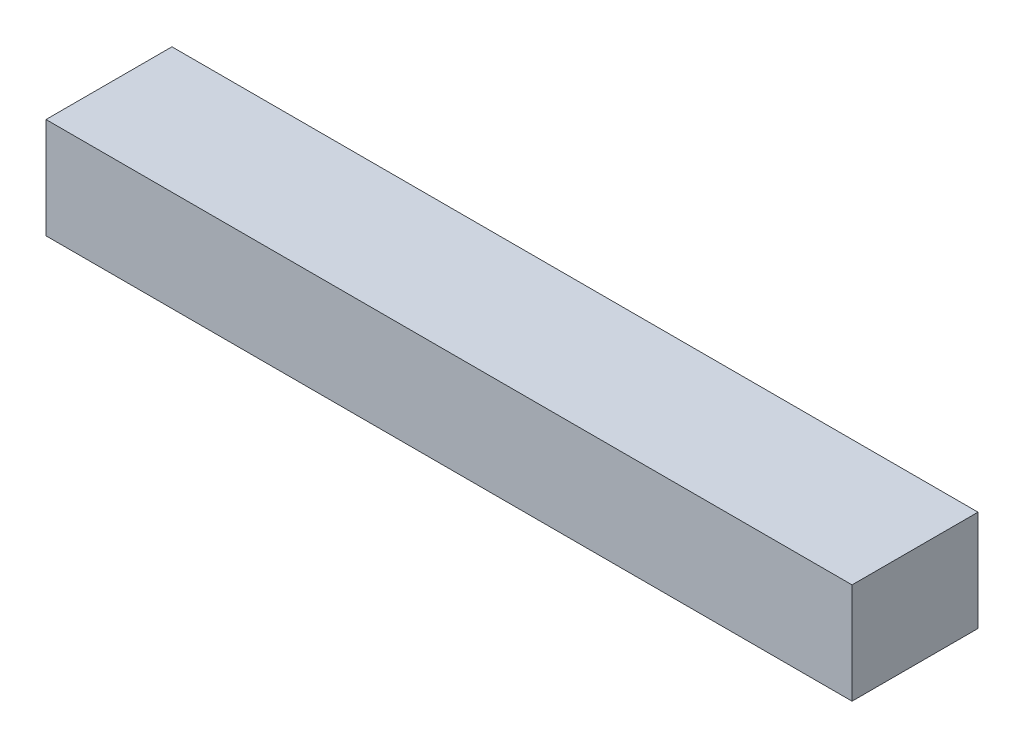
ISO-10303-21;
HEADER;
FILE_DESCRIPTION(('STEP AP214'),'2;1');
FILE_NAME('part.step','',(''),(''),'','','');
FILE_SCHEMA(('AUTOMOTIVE_DESIGN { 1 0 10303 214 1 1 1 1 }'));
ENDSEC;
DATA;
#1=APPLICATION_CONTEXT('core data for automotive mechanical design processes');
#2=APPLICATION_PROTOCOL_DEFINITION('international standard','automotive_design',2000,#1);
#3=PRODUCT_CONTEXT('',#1,'mechanical');
#4=PRODUCT('Part','Part','',(#3));
#5=PRODUCT_RELATED_PRODUCT_CATEGORY('part','',(#4));
#6=PRODUCT_DEFINITION_FORMATION('','',#4);
#7=PRODUCT_DEFINITION_CONTEXT('part definition',#1,'design');
#8=PRODUCT_DEFINITION('design','',#6,#7);
#9=PRODUCT_DEFINITION_SHAPE('','',#8);
#10=(LENGTH_UNIT() NAMED_UNIT(*) SI_UNIT(.MILLI.,.METRE.));
#11=(NAMED_UNIT(*) PLANE_ANGLE_UNIT() SI_UNIT($,.RADIAN.));
#12=(NAMED_UNIT(*) SI_UNIT($,.STERADIAN.) SOLID_ANGLE_UNIT());
#13=UNCERTAINTY_MEASURE_WITH_UNIT(LENGTH_MEASURE(1.E-05),#10,'distance_accuracy_value','');
#14=(GEOMETRIC_REPRESENTATION_CONTEXT(3) GLOBAL_UNCERTAINTY_ASSIGNED_CONTEXT((#13)) GLOBAL_UNIT_ASSIGNED_CONTEXT((#10,
#11,#12)) REPRESENTATION_CONTEXT('',''));
#15=CARTESIAN_POINT('',(0.,0.,0.));
#16=DIRECTION('',(0.,0.,1.));
#17=DIRECTION('',(1.,0.,0.));
#18=AXIS2_PLACEMENT_3D('',#15,#16,#17);
#19=CARTESIAN_POINT('',(4.3681,7.1331,0.8));
#20=DIRECTION('',(0.,1.,0.));
#21=DIRECTION('',(-1.,0.,0.));
#22=AXIS2_PLACEMENT_3D('',#19,#20,#21);
#23=PLANE('',#22);
#24=DIRECTION('',(1.,0.,0.));
#25=VECTOR('',#24,1.);
#26=CARTESIAN_POINT('',(0.,7.1331,2.05));
#27=LINE('',#26,#25);
#28=CARTESIAN_POINT('',(4.3681,7.1331,2.05));
#29=VERTEX_POINT('',#28);
#30=CARTESIAN_POINT('',(-3.6319,7.1331,2.05));
#31=VERTEX_POINT('',#30);
#32=EDGE_CURVE('E69',#29,#31,#27,.F.);
#33=ORIENTED_EDGE('',*,*,#32,.F.);
#34=DIRECTION('',(0.,0.,1.));
#35=VECTOR('',#34,1.);
#36=CARTESIAN_POINT('',(4.3681,7.1331,0.8));
#37=LINE('',#36,#35);
#38=CARTESIAN_POINT('',(4.3681,7.1331,0.8));
#39=VERTEX_POINT('',#38);
#40=EDGE_CURVE('E56',#39,#29,#37,.T.);
#41=ORIENTED_EDGE('',*,*,#40,.F.);
#42=DIRECTION('',(1.,0.,0.));
#43=VECTOR('',#42,1.);
#44=CARTESIAN_POINT('',(0.,7.1331,0.8));
#45=LINE('',#44,#43);
#46=CARTESIAN_POINT('',(-3.6319,7.1331,0.8));
#47=VERTEX_POINT('',#46);
#48=EDGE_CURVE('E62',#39,#47,#45,.F.);
#49=ORIENTED_EDGE('',*,*,#48,.T.);
#50=DIRECTION('',(0.,0.,1.));
#51=VECTOR('',#50,1.);
#52=CARTESIAN_POINT('',(-3.6319,7.1331,0.8));
#53=LINE('',#52,#51);
#54=EDGE_CURVE('E20',#47,#31,#53,.T.);
#55=ORIENTED_EDGE('',*,*,#54,.T.);
#56=EDGE_LOOP('',(#33,#41,#49,#55));
#57=FACE_BOUND('',#56,.T.);
#58=ADVANCED_FACE('F17',(#57),#23,.T.);
#59=CARTESIAN_POINT('',(0.,0.,0.8));
#60=DIRECTION('',(0.,0.,1.));
#61=DIRECTION('',(1.,0.,0.));
#62=AXIS2_PLACEMENT_3D('',#59,#60,#61);
#63=PLANE('',#62);
#64=ORIENTED_EDGE('',*,*,#48,.F.);
#65=DIRECTION('',(0.,1.,0.));
#66=VECTOR('',#65,1.);
#67=CARTESIAN_POINT('',(4.3681,6.1331,0.8));
#68=LINE('',#67,#66);
#69=CARTESIAN_POINT('',(4.3681,6.1331,0.8));
#70=VERTEX_POINT('',#69);
#71=EDGE_CURVE('E64',#70,#39,#68,.T.);
#72=ORIENTED_EDGE('',*,*,#71,.F.);
#73=DIRECTION('',(1.,0.,0.));
#74=VECTOR('',#73,1.);
#75=CARTESIAN_POINT('',(-3.6319,6.1331,0.8));
#76=LINE('',#75,#74);
#77=CARTESIAN_POINT('',(-3.6319,6.1331,0.8));
#78=VERTEX_POINT('',#77);
#79=EDGE_CURVE('E83',#78,#70,#76,.T.);
#80=ORIENTED_EDGE('',*,*,#79,.F.);
#81=DIRECTION('',(0.,-1.,0.));
#82=VECTOR('',#81,1.);
#83=CARTESIAN_POINT('',(-3.6319,7.1331,0.8));
#84=LINE('',#83,#82);
#85=EDGE_CURVE('E67',#47,#78,#84,.T.);
#86=ORIENTED_EDGE('',*,*,#85,.F.);
#87=EDGE_LOOP('',(#64,#72,#80,#86));
#88=FACE_BOUND('',#87,.T.);
#89=ADVANCED_FACE('F63',(#88),#63,.F.);
#90=CARTESIAN_POINT('',(4.3681,6.1331,0.8));
#91=DIRECTION('',(1.,0.,0.));
#92=DIRECTION('',(0.,1.,0.));
#93=AXIS2_PLACEMENT_3D('',#90,#91,#92);
#94=PLANE('',#93);
#95=DIRECTION('',(0.,1.,0.));
#96=VECTOR('',#95,1.);
#97=CARTESIAN_POINT('',(4.3681,0.,2.05));
#98=LINE('',#97,#96);
#99=CARTESIAN_POINT('',(4.3681,6.1331,2.05));
#100=VERTEX_POINT('',#99);
#101=EDGE_CURVE('E71',#100,#29,#98,.T.);
#102=ORIENTED_EDGE('',*,*,#101,.F.);
#103=DIRECTION('',(0.,0.,1.));
#104=VECTOR('',#103,1.);
#105=CARTESIAN_POINT('',(4.3681,6.1331,0.8));
#106=LINE('',#105,#104);
#107=EDGE_CURVE('E75',#70,#100,#106,.T.);
#108=ORIENTED_EDGE('',*,*,#107,.F.);
#109=ORIENTED_EDGE('',*,*,#71,.T.);
#110=ORIENTED_EDGE('',*,*,#40,.T.);
#111=EDGE_LOOP('',(#102,#108,#109,#110));
#112=FACE_BOUND('',#111,.T.);
#113=ADVANCED_FACE('F73',(#112),#94,.T.);
#114=CARTESIAN_POINT('',(0.,0.,2.05));
#115=DIRECTION('',(0.,0.,1.));
#116=DIRECTION('',(1.,0.,0.));
#117=AXIS2_PLACEMENT_3D('',#114,#115,#116);
#118=PLANE('',#117);
#119=ORIENTED_EDGE('',*,*,#101,.T.);
#120=ORIENTED_EDGE('',*,*,#32,.T.);
#121=DIRECTION('',(0.,-1.,0.));
#122=VECTOR('',#121,1.);
#123=CARTESIAN_POINT('',(-3.6319,7.1331,2.05));
#124=LINE('',#123,#122);
#125=CARTESIAN_POINT('',(-3.6319,6.1331,2.05));
#126=VERTEX_POINT('',#125);
#127=EDGE_CURVE('E35',#126,#31,#124,.F.);
#128=ORIENTED_EDGE('',*,*,#127,.F.);
#129=DIRECTION('',(1.,0.,0.));
#130=VECTOR('',#129,1.);
#131=CARTESIAN_POINT('',(-3.6319,6.1331,2.05));
#132=LINE('',#131,#130);
#133=EDGE_CURVE('E26',#100,#126,#132,.F.);
#134=ORIENTED_EDGE('',*,*,#133,.F.);
#135=EDGE_LOOP('',(#119,#120,#128,#134));
#136=FACE_BOUND('',#135,.T.);
#137=ADVANCED_FACE('F89',(#136),#118,.T.);
#138=CARTESIAN_POINT('',(-3.6319,7.1331,0.8));
#139=DIRECTION('',(-1.,0.,0.));
#140=DIRECTION('',(0.,-1.,0.));
#141=AXIS2_PLACEMENT_3D('',#138,#139,#140);
#142=PLANE('',#141);
#143=ORIENTED_EDGE('',*,*,#127,.T.);
#144=ORIENTED_EDGE('',*,*,#54,.F.);
#145=ORIENTED_EDGE('',*,*,#85,.T.);
#146=DIRECTION('',(0.,0.,1.));
#147=VECTOR('',#146,1.);
#148=CARTESIAN_POINT('',(-3.6319,6.1331,0.8));
#149=LINE('',#148,#147);
#150=EDGE_CURVE('E11',#126,#78,#149,.F.);
#151=ORIENTED_EDGE('',*,*,#150,.F.);
#152=EDGE_LOOP('',(#143,#144,#145,#151));
#153=FACE_BOUND('',#152,.T.);
#154=ADVANCED_FACE('F91',(#153),#142,.T.);
#155=CARTESIAN_POINT('',(-3.6319,6.1331,0.8));
#156=DIRECTION('',(0.,-1.,0.));
#157=DIRECTION('',(1.,0.,0.));
#158=AXIS2_PLACEMENT_3D('',#155,#156,#157);
#159=PLANE('',#158);
#160=ORIENTED_EDGE('',*,*,#133,.T.);
#161=ORIENTED_EDGE('',*,*,#150,.T.);
#162=ORIENTED_EDGE('',*,*,#79,.T.);
#163=ORIENTED_EDGE('',*,*,#107,.T.);
#164=EDGE_LOOP('',(#160,#161,#162,#163));
#165=FACE_BOUND('',#164,.T.);
#166=ADVANCED_FACE('F88',(#165),#159,.T.);
#167=CLOSED_SHELL('',(#58,#89,#113,#137,#154,#166));
#168=MANIFOLD_SOLID_BREP('B1',#167);
#169=ADVANCED_BREP_SHAPE_REPRESENTATION('',(#18,#168),#14);
#170=SHAPE_DEFINITION_REPRESENTATION(#9,#169);
ENDSEC;
END-ISO-10303-21;
